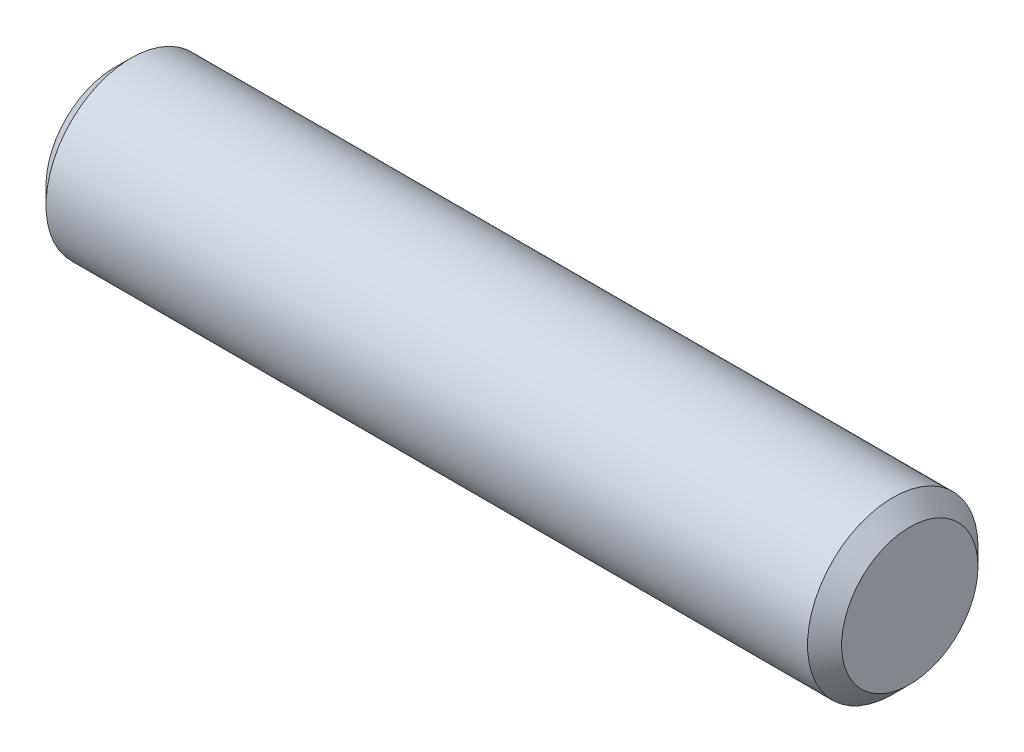
ISO-10303-21;
HEADER;
FILE_DESCRIPTION(('STEP AP214'),'2;1');
FILE_NAME('part.step','',(''),(''),'','','');
FILE_SCHEMA(('AUTOMOTIVE_DESIGN { 1 0 10303 214 1 1 1 1 }'));
ENDSEC;
DATA;
#1=APPLICATION_CONTEXT('core data for automotive mechanical design processes');
#2=APPLICATION_PROTOCOL_DEFINITION('international standard','automotive_design',2000,#1);
#3=PRODUCT_CONTEXT('',#1,'mechanical');
#4=PRODUCT('Part','Part','',(#3));
#5=PRODUCT_RELATED_PRODUCT_CATEGORY('part','',(#4));
#6=PRODUCT_DEFINITION_FORMATION('','',#4);
#7=PRODUCT_DEFINITION_CONTEXT('part definition',#1,'design');
#8=PRODUCT_DEFINITION('design','',#6,#7);
#9=PRODUCT_DEFINITION_SHAPE('','',#8);
#10=(LENGTH_UNIT() NAMED_UNIT(*) SI_UNIT(.MILLI.,.METRE.));
#11=(NAMED_UNIT(*) PLANE_ANGLE_UNIT() SI_UNIT($,.RADIAN.));
#12=(NAMED_UNIT(*) SI_UNIT($,.STERADIAN.) SOLID_ANGLE_UNIT());
#13=UNCERTAINTY_MEASURE_WITH_UNIT(LENGTH_MEASURE(1.E-05),#10,'distance_accuracy_value','');
#14=(GEOMETRIC_REPRESENTATION_CONTEXT(3) GLOBAL_UNCERTAINTY_ASSIGNED_CONTEXT((#13)) GLOBAL_UNIT_ASSIGNED_CONTEXT((#10,
#11,#12)) REPRESENTATION_CONTEXT('',''));
#15=CARTESIAN_POINT('',(0.,0.,0.));
#16=DIRECTION('',(0.,0.,1.));
#17=DIRECTION('',(1.,0.,0.));
#18=AXIS2_PLACEMENT_3D('',#15,#16,#17);
#19=CARTESIAN_POINT('',(-7.,0.,0.));
#20=DIRECTION('',(1.,0.,0.));
#21=DIRECTION('',(0.,0.,-1.));
#22=AXIS2_PLACEMENT_3D('',#19,#20,#21);
#23=CYLINDRICAL_SURFACE('',#22,1.5);
#24=CARTESIAN_POINT('',(-6.7,0.,0.));
#25=DIRECTION('',(1.,0.,0.));
#26=DIRECTION('',(0.,0.,-1.));
#27=AXIS2_PLACEMENT_3D('',#24,#25,#26);
#28=CIRCLE('',#27,1.5);
#29=CARTESIAN_POINT('',(-6.7,0.,-1.5));
#30=VERTEX_POINT('',#29);
#31=EDGE_CURVE('E41',#30,#30,#28,.T.);
#32=ORIENTED_EDGE('',*,*,#31,.T.);
#33=EDGE_LOOP('',(#32));
#34=FACE_BOUND('',#33,.T.);
#35=CARTESIAN_POINT('',(6.7,0.,0.));
#36=DIRECTION('',(1.,0.,0.));
#37=DIRECTION('',(0.,0.,-1.));
#38=AXIS2_PLACEMENT_3D('',#35,#36,#37);
#39=CIRCLE('',#38,1.5);
#40=CARTESIAN_POINT('',(6.7,0.,-1.5));
#41=VERTEX_POINT('',#40);
#42=EDGE_CURVE('E45',#41,#41,#39,.F.);
#43=ORIENTED_EDGE('',*,*,#42,.T.);
#44=EDGE_LOOP('',(#43));
#45=FACE_BOUND('',#44,.T.);
#46=ADVANCED_FACE('F30',(#34,#45),#23,.T.);
#47=CARTESIAN_POINT('',(-7.,0.,0.));
#48=DIRECTION('',(1.,0.,0.));
#49=DIRECTION('',(0.,0.,-1.));
#50=AXIS2_PLACEMENT_3D('',#47,#48,#49);
#51=PLANE('',#50);
#52=CARTESIAN_POINT('',(-7.,0.,0.));
#53=DIRECTION('',(1.,0.,0.));
#54=DIRECTION('',(0.,0.,-1.));
#55=AXIS2_PLACEMENT_3D('',#52,#53,#54);
#56=CIRCLE('',#55,1.2);
#57=CARTESIAN_POINT('',(-7.,0.,-1.2));
#58=VERTEX_POINT('',#57);
#59=EDGE_CURVE('E37',#58,#58,#56,.F.);
#60=ORIENTED_EDGE('',*,*,#59,.T.);
#61=EDGE_LOOP('',(#60));
#62=FACE_BOUND('',#61,.T.);
#63=ADVANCED_FACE('F61',(#62),#51,.F.);
#64=CARTESIAN_POINT('',(7.,0.,0.));
#65=DIRECTION('',(1.,0.,0.));
#66=DIRECTION('',(0.,0.,-1.));
#67=AXIS2_PLACEMENT_3D('',#64,#65,#66);
#68=PLANE('',#67);
#69=CARTESIAN_POINT('',(7.,0.,0.));
#70=DIRECTION('',(1.,0.,0.));
#71=DIRECTION('',(0.,0.,-1.));
#72=AXIS2_PLACEMENT_3D('',#69,#70,#71);
#73=CIRCLE('',#72,1.2);
#74=CARTESIAN_POINT('',(7.,0.,-1.2));
#75=VERTEX_POINT('',#74);
#76=EDGE_CURVE('E10',#75,#75,#73,.T.);
#77=ORIENTED_EDGE('',*,*,#76,.T.);
#78=EDGE_LOOP('',(#77));
#79=FACE_BOUND('',#78,.T.);
#80=ADVANCED_FACE('F58',(#79),#68,.T.);
#81=CARTESIAN_POINT('',(-6.7,0.,0.));
#82=DIRECTION('',(1.,0.,0.));
#83=DIRECTION('',(0.,0.,-1.));
#84=AXIS2_PLACEMENT_3D('',#81,#82,#83);
#85=CONICAL_SURFACE('',#84,1.5,0.78539816339745);
#86=ORIENTED_EDGE('',*,*,#59,.F.);
#87=EDGE_LOOP('',(#86));
#88=FACE_BOUND('',#87,.T.);
#89=ORIENTED_EDGE('',*,*,#31,.F.);
#90=EDGE_LOOP('',(#89));
#91=FACE_BOUND('',#90,.T.);
#92=ADVANCED_FACE('F54',(#88,#91),#85,.T.);
#93=CARTESIAN_POINT('',(7.,0.,0.));
#94=DIRECTION('',(-1.,0.,0.));
#95=DIRECTION('',(0.,0.,1.));
#96=AXIS2_PLACEMENT_3D('',#93,#94,#95);
#97=CONICAL_SURFACE('',#96,1.2,0.78539816339745);
#98=ORIENTED_EDGE('',*,*,#42,.F.);
#99=EDGE_LOOP('',(#98));
#100=FACE_BOUND('',#99,.T.);
#101=ORIENTED_EDGE('',*,*,#76,.F.);
#102=EDGE_LOOP('',(#101));
#103=FACE_BOUND('',#102,.T.);
#104=ADVANCED_FACE('F32',(#100,#103),#97,.T.);
#105=CLOSED_SHELL('',(#46,#63,#80,#92,#104));
#106=MANIFOLD_SOLID_BREP('B2',#105);
#107=ADVANCED_BREP_SHAPE_REPRESENTATION('',(#18,#106),#14);
#108=SHAPE_DEFINITION_REPRESENTATION(#9,#107);
ENDSEC;
END-ISO-10303-21;
